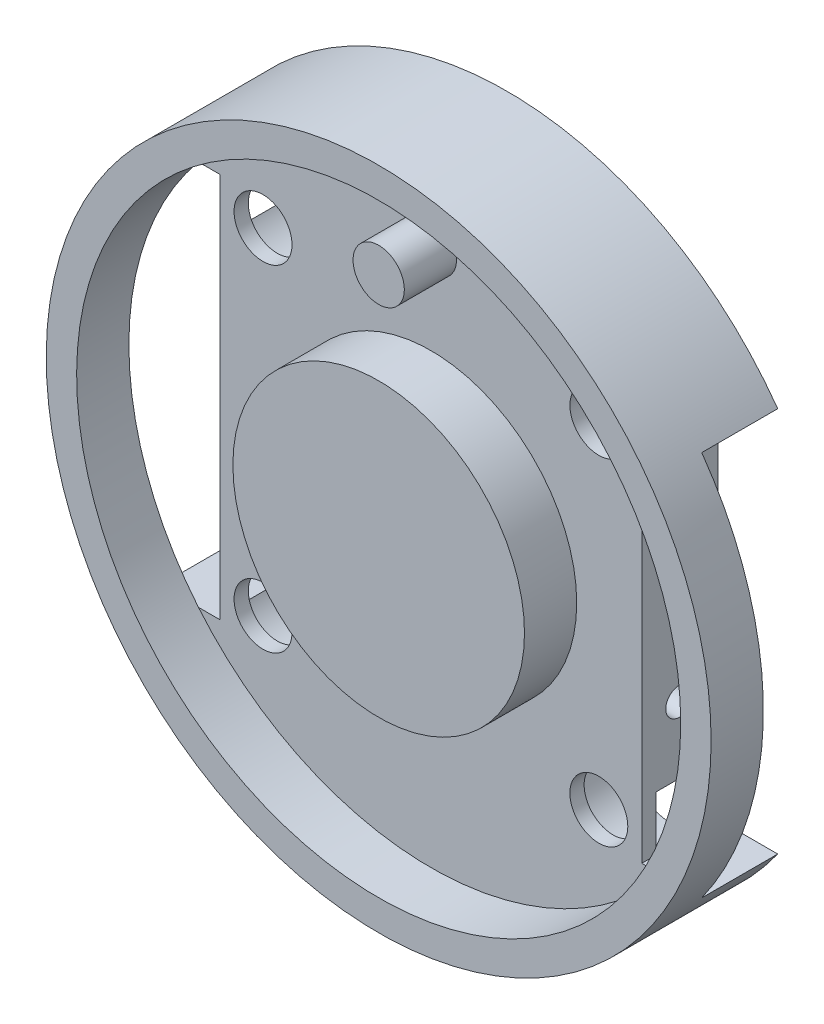
ISO-10303-21;
HEADER;
FILE_DESCRIPTION(('STEP AP214'),'2;1');
FILE_NAME('part.step','',(''),(''),'','','');
FILE_SCHEMA(('AUTOMOTIVE_DESIGN { 1 0 10303 214 1 1 1 1 }'));
ENDSEC;
DATA;
#1=APPLICATION_CONTEXT('core data for automotive mechanical design processes');
#2=APPLICATION_PROTOCOL_DEFINITION('international standard','automotive_design',2000,#1);
#3=PRODUCT_CONTEXT('',#1,'mechanical');
#4=PRODUCT('Part','Part','',(#3));
#5=PRODUCT_RELATED_PRODUCT_CATEGORY('part','',(#4));
#6=PRODUCT_DEFINITION_FORMATION('','',#4);
#7=PRODUCT_DEFINITION_CONTEXT('part definition',#1,'design');
#8=PRODUCT_DEFINITION('design','',#6,#7);
#9=PRODUCT_DEFINITION_SHAPE('','',#8);
#10=(LENGTH_UNIT() NAMED_UNIT(*) SI_UNIT(.MILLI.,.METRE.));
#11=(NAMED_UNIT(*) PLANE_ANGLE_UNIT() SI_UNIT($,.RADIAN.));
#12=(NAMED_UNIT(*) SI_UNIT($,.STERADIAN.) SOLID_ANGLE_UNIT());
#13=UNCERTAINTY_MEASURE_WITH_UNIT(LENGTH_MEASURE(1.E-05),#10,'distance_accuracy_value','');
#14=(GEOMETRIC_REPRESENTATION_CONTEXT(3) GLOBAL_UNCERTAINTY_ASSIGNED_CONTEXT((#13)) GLOBAL_UNIT_ASSIGNED_CONTEXT((#10,
#11,#12)) REPRESENTATION_CONTEXT('',''));
#15=CARTESIAN_POINT('',(0.,0.,0.));
#16=DIRECTION('',(0.,0.,1.));
#17=DIRECTION('',(1.,0.,0.));
#18=AXIS2_PLACEMENT_3D('',#15,#16,#17);
#19=CARTESIAN_POINT('',(17.6776695296638,-17.6776695296636,-0.000999999999999265));
#20=DIRECTION('',(0.,0.,1.));
#21=DIRECTION('',(1.,0.,0.));
#22=AXIS2_PLACEMENT_3D('',#19,#20,#21);
#23=CYLINDRICAL_SURFACE('',#22,3.05);
#24=CARTESIAN_POINT('',(17.6776695296638,-17.6776695296636,8.));
#25=DIRECTION('',(0.,0.,1.));
#26=DIRECTION('',(1.,0.,0.));
#27=AXIS2_PLACEMENT_3D('',#24,#25,#26);
#28=CIRCLE('',#27,3.05);
#29=CARTESIAN_POINT('',(20.7276695296638,-17.6776695296636,8.));
#30=VERTEX_POINT('',#29);
#31=EDGE_CURVE('E217',#30,#30,#28,.T.);
#32=ORIENTED_EDGE('',*,*,#31,.T.);
#33=EDGE_LOOP('',(#32));
#34=FACE_BOUND('',#33,.T.);
#35=CARTESIAN_POINT('',(17.6776695296638,-17.6776695296636,6.5));
#36=DIRECTION('',(0.,0.,-1.));
#37=DIRECTION('',(-1.,0.,0.));
#38=AXIS2_PLACEMENT_3D('',#35,#36,#37);
#39=CIRCLE('',#38,3.05);
#40=CARTESIAN_POINT('',(14.6276695296638,-17.6776695296636,6.5));
#41=VERTEX_POINT('',#40);
#42=EDGE_CURVE('E285',#41,#41,#39,.F.);
#43=ORIENTED_EDGE('',*,*,#42,.F.);
#44=EDGE_LOOP('',(#43));
#45=FACE_BOUND('',#44,.T.);
#46=ADVANCED_FACE('F47',(#34,#45),#23,.F.);
#47=CARTESIAN_POINT('',(17.6776695296636,17.6776695296638,-0.000999999999999265));
#48=DIRECTION('',(0.,0.,1.));
#49=DIRECTION('',(1.,0.,0.));
#50=AXIS2_PLACEMENT_3D('',#47,#48,#49);
#51=CYLINDRICAL_SURFACE('',#50,3.05);
#52=CARTESIAN_POINT('',(17.6776695296636,17.6776695296638,8.));
#53=DIRECTION('',(0.,0.,1.));
#54=DIRECTION('',(1.,0.,0.));
#55=AXIS2_PLACEMENT_3D('',#52,#53,#54);
#56=CIRCLE('',#55,3.05);
#57=CARTESIAN_POINT('',(20.7276695296636,17.6776695296638,8.));
#58=VERTEX_POINT('',#57);
#59=EDGE_CURVE('E365',#58,#58,#56,.T.);
#60=ORIENTED_EDGE('',*,*,#59,.T.);
#61=EDGE_LOOP('',(#60));
#62=FACE_BOUND('',#61,.T.);
#63=CARTESIAN_POINT('',(17.6776695296636,17.6776695296638,6.5));
#64=DIRECTION('',(0.,0.,-1.));
#65=DIRECTION('',(-1.,0.,0.));
#66=AXIS2_PLACEMENT_3D('',#63,#64,#65);
#67=CIRCLE('',#66,3.05);
#68=CARTESIAN_POINT('',(14.6276695296636,17.6776695296638,6.5));
#69=VERTEX_POINT('',#68);
#70=EDGE_CURVE('E280',#69,#69,#67,.F.);
#71=ORIENTED_EDGE('',*,*,#70,.F.);
#72=EDGE_LOOP('',(#71));
#73=FACE_BOUND('',#72,.T.);
#74=ADVANCED_FACE('F454',(#62,#73),#51,.F.);
#75=CARTESIAN_POINT('',(-17.6776695296638,17.6776695296636,-0.000999999999999265));
#76=DIRECTION('',(0.,0.,1.));
#77=DIRECTION('',(1.,0.,0.));
#78=AXIS2_PLACEMENT_3D('',#75,#76,#77);
#79=CYLINDRICAL_SURFACE('',#78,3.05);
#80=CARTESIAN_POINT('',(-17.6776695296638,17.6776695296636,8.));
#81=DIRECTION('',(0.,0.,1.));
#82=DIRECTION('',(1.,0.,0.));
#83=AXIS2_PLACEMENT_3D('',#80,#81,#82);
#84=CIRCLE('',#83,3.05);
#85=CARTESIAN_POINT('',(-14.6276695296638,17.6776695296636,8.));
#86=VERTEX_POINT('',#85);
#87=EDGE_CURVE('E368',#86,#86,#84,.T.);
#88=ORIENTED_EDGE('',*,*,#87,.T.);
#89=EDGE_LOOP('',(#88));
#90=FACE_BOUND('',#89,.T.);
#91=CARTESIAN_POINT('',(-17.6776695296638,17.6776695296636,6.5));
#92=DIRECTION('',(0.,0.,-1.));
#93=DIRECTION('',(-1.,0.,0.));
#94=AXIS2_PLACEMENT_3D('',#91,#92,#93);
#95=CIRCLE('',#94,3.05);
#96=CARTESIAN_POINT('',(-20.7276695296638,17.6776695296636,6.5));
#97=VERTEX_POINT('',#96);
#98=EDGE_CURVE('E275',#97,#97,#95,.F.);
#99=ORIENTED_EDGE('',*,*,#98,.F.);
#100=EDGE_LOOP('',(#99));
#101=FACE_BOUND('',#100,.T.);
#102=ADVANCED_FACE('F461',(#90,#101),#79,.F.);
#103=CARTESIAN_POINT('',(-17.6776695296636,-17.6776695296638,-0.000999999999999265));
#104=DIRECTION('',(0.,0.,1.));
#105=DIRECTION('',(1.,0.,0.));
#106=AXIS2_PLACEMENT_3D('',#103,#104,#105);
#107=CYLINDRICAL_SURFACE('',#106,3.05);
#108=CARTESIAN_POINT('',(-17.6776695296636,-17.6776695296638,8.));
#109=DIRECTION('',(0.,0.,1.));
#110=DIRECTION('',(1.,0.,0.));
#111=AXIS2_PLACEMENT_3D('',#108,#109,#110);
#112=CIRCLE('',#111,3.05);
#113=CARTESIAN_POINT('',(-14.6276695296636,-17.6776695296638,8.));
#114=VERTEX_POINT('',#113);
#115=EDGE_CURVE('E359',#114,#114,#112,.T.);
#116=ORIENTED_EDGE('',*,*,#115,.T.);
#117=EDGE_LOOP('',(#116));
#118=FACE_BOUND('',#117,.T.);
#119=CARTESIAN_POINT('',(-17.6776695296636,-17.6776695296638,6.5));
#120=DIRECTION('',(0.,0.,-1.));
#121=DIRECTION('',(-1.,0.,0.));
#122=AXIS2_PLACEMENT_3D('',#119,#120,#121);
#123=CIRCLE('',#122,3.05);
#124=CARTESIAN_POINT('',(-20.7276695296636,-17.6776695296638,6.5));
#125=VERTEX_POINT('',#124);
#126=EDGE_CURVE('E271',#125,#125,#123,.F.);
#127=ORIENTED_EDGE('',*,*,#126,.F.);
#128=EDGE_LOOP('',(#127));
#129=FACE_BOUND('',#128,.T.);
#130=ADVANCED_FACE('F373',(#118,#129),#107,.F.);
#131=CARTESIAN_POINT('',(0.,0.,8.));
#132=DIRECTION('',(0.,0.,1.));
#133=DIRECTION('',(1.,0.,0.));
#134=AXIS2_PLACEMENT_3D('',#131,#132,#133);
#135=PLANE('',#134);
#136=CARTESIAN_POINT('',(0.,0.,8.));
#137=DIRECTION('',(0.,0.,1.));
#138=DIRECTION('',(1.,0.,0.));
#139=AXIS2_PLACEMENT_3D('',#136,#137,#138);
#140=CIRCLE('',#139,15.3499999999999);
#141=CARTESIAN_POINT('',(-15.3499999999999,0.,8.));
#142=VERTEX_POINT('',#141);
#143=EDGE_CURVE('E340',#142,#142,#140,.T.);
#144=ORIENTED_EDGE('',*,*,#143,.F.);
#145=EDGE_LOOP('',(#144));
#146=FACE_BOUND('',#145,.T.);
#147=CARTESIAN_POINT('',(1.11022302462516E-13,24.9999999999999,8.));
#148=DIRECTION('',(0.,0.,1.));
#149=DIRECTION('',(1.,0.,0.));
#150=AXIS2_PLACEMENT_3D('',#147,#148,#149);
#151=CIRCLE('',#150,2.7);
#152=CARTESIAN_POINT('',(2.70000000000011,24.9999999999999,8.));
#153=VERTEX_POINT('',#152);
#154=EDGE_CURVE('E346',#153,#153,#151,.T.);
#155=ORIENTED_EDGE('',*,*,#154,.F.);
#156=EDGE_LOOP('',(#155));
#157=FACE_BOUND('',#156,.T.);
#158=ORIENTED_EDGE('',*,*,#115,.F.);
#159=EDGE_LOOP('',(#158));
#160=FACE_BOUND('',#159,.T.);
#161=ORIENTED_EDGE('',*,*,#87,.F.);
#162=EDGE_LOOP('',(#161));
#163=FACE_BOUND('',#162,.T.);
#164=ORIENTED_EDGE('',*,*,#59,.F.);
#165=EDGE_LOOP('',(#164));
#166=FACE_BOUND('',#165,.T.);
#167=ORIENTED_EDGE('',*,*,#31,.F.);
#168=EDGE_LOOP('',(#167));
#169=FACE_BOUND('',#168,.T.);
#170=DIRECTION('',(1.,0.,0.));
#171=VECTOR('',#170,1.);
#172=CARTESIAN_POINT('',(28.5115765961828,20.3,8.00000000000001));
#173=LINE('',#172,#171);
#174=CARTESIAN_POINT('',(22.2,20.3,8.00000000000001));
#175=VERTEX_POINT('',#174);
#176=CARTESIAN_POINT('',(24.4775407261432,20.3,8.));
#177=VERTEX_POINT('',#176);
#178=EDGE_CURVE('E248',#175,#177,#173,.T.);
#179=ORIENTED_EDGE('',*,*,#178,.T.);
#180=CARTESIAN_POINT('',(0.,0.,8.));
#181=DIRECTION('',(0.,0.,1.));
#182=DIRECTION('',(1.,0.,0.));
#183=AXIS2_PLACEMENT_3D('',#180,#181,#182);
#184=CIRCLE('',#183,31.8);
#185=CARTESIAN_POINT('',(-24.4775407261432,20.3,8.));
#186=VERTEX_POINT('',#185);
#187=EDGE_CURVE('E58',#177,#186,#184,.T.);
#188=ORIENTED_EDGE('',*,*,#187,.T.);
#189=DIRECTION('',(1.,0.,0.));
#190=VECTOR('',#189,1.);
#191=CARTESIAN_POINT('',(-22.2,20.3,8.00000000000001));
#192=LINE('',#191,#190);
#193=CARTESIAN_POINT('',(-22.2,20.3,8.00000000000001));
#194=VERTEX_POINT('',#193);
#195=EDGE_CURVE('E247',#186,#194,#192,.T.);
#196=ORIENTED_EDGE('',*,*,#195,.T.);
#197=DIRECTION('',(0.,-1.,0.));
#198=VECTOR('',#197,1.);
#199=CARTESIAN_POINT('',(-22.2,-20.3,8.00000000000001));
#200=LINE('',#199,#198);
#201=CARTESIAN_POINT('',(-22.2,-20.3,8.00000000000001));
#202=VERTEX_POINT('',#201);
#203=EDGE_CURVE('E56',#194,#202,#200,.T.);
#204=ORIENTED_EDGE('',*,*,#203,.T.);
#205=DIRECTION('',(-1.,0.,0.));
#206=VECTOR('',#205,1.);
#207=CARTESIAN_POINT('',(-22.2,-20.3,8.00000000000001));
#208=LINE('',#207,#206);
#209=CARTESIAN_POINT('',(-24.4775407261432,-20.3,8.));
#210=VERTEX_POINT('',#209);
#211=EDGE_CURVE('E211',#202,#210,#208,.T.);
#212=ORIENTED_EDGE('',*,*,#211,.T.);
#213=CARTESIAN_POINT('',(24.4775407261432,-20.3,8.));
#214=VERTEX_POINT('',#213);
#215=EDGE_CURVE('E12',#210,#214,#184,.T.);
#216=ORIENTED_EDGE('',*,*,#215,.T.);
#217=DIRECTION('',(-1.,0.,0.));
#218=VECTOR('',#217,1.);
#219=CARTESIAN_POINT('',(28.5115765961828,-20.3,8.00000000000001));
#220=LINE('',#219,#218);
#221=CARTESIAN_POINT('',(22.2,-20.3,8.00000000000001));
#222=VERTEX_POINT('',#221);
#223=EDGE_CURVE('E257',#214,#222,#220,.T.);
#224=ORIENTED_EDGE('',*,*,#223,.T.);
#225=DIRECTION('',(0.,1.,0.));
#226=VECTOR('',#225,1.);
#227=CARTESIAN_POINT('',(22.2,-20.3,8.00000000000001));
#228=LINE('',#227,#226);
#229=EDGE_CURVE('E252',#222,#175,#228,.T.);
#230=ORIENTED_EDGE('',*,*,#229,.T.);
#231=EDGE_LOOP('',(#179,#188,#196,#204,#212,#216,#224,#230));
#232=FACE_BOUND('',#231,.T.);
#233=ADVANCED_FACE('F49',(#146,#157,#160,#163,#166,#169,#232),#135,.T.);
#234=CARTESIAN_POINT('',(0.,0.,98.2864330893629));
#235=DIRECTION('',(0.,0.,-1.));
#236=DIRECTION('',(-1.,0.,0.));
#237=AXIS2_PLACEMENT_3D('',#234,#235,#236);
#238=CYLINDRICAL_SURFACE('',#237,35.);
#239=DIRECTION('',(0.,0.,-1.));
#240=VECTOR('',#239,1.);
#241=CARTESIAN_POINT('',(28.5115765961828,-20.3,98.2864330893629));
#242=LINE('',#241,#240);
#243=CARTESIAN_POINT('',(28.5115765961828,-20.3,8.));
#244=VERTEX_POINT('',#243);
#245=CARTESIAN_POINT('',(28.5115765961828,-20.3,0.));
#246=VERTEX_POINT('',#245);
#247=EDGE_CURVE('E239',#244,#246,#242,.T.);
#248=ORIENTED_EDGE('',*,*,#247,.F.);
#249=CARTESIAN_POINT('',(0.,0.,8.));
#250=DIRECTION('',(0.,0.,1.));
#251=DIRECTION('',(1.,0.,0.));
#252=AXIS2_PLACEMENT_3D('',#249,#250,#251);
#253=CIRCLE('',#252,35.);
#254=CARTESIAN_POINT('',(28.5115765961828,20.3,8.));
#255=VERTEX_POINT('',#254);
#256=EDGE_CURVE('E350',#244,#255,#253,.T.);
#257=ORIENTED_EDGE('',*,*,#256,.T.);
#258=DIRECTION('',(0.,0.,-1.));
#259=VECTOR('',#258,1.);
#260=CARTESIAN_POINT('',(28.5115765961828,20.3,98.2864330893629));
#261=LINE('',#260,#259);
#262=CARTESIAN_POINT('',(28.5115765961828,20.3,0.));
#263=VERTEX_POINT('',#262);
#264=EDGE_CURVE('E228',#255,#263,#261,.T.);
#265=ORIENTED_EDGE('',*,*,#264,.T.);
#266=CARTESIAN_POINT('',(0.,0.,0.));
#267=DIRECTION('',(0.,0.,1.));
#268=DIRECTION('',(1.,0.,0.));
#269=AXIS2_PLACEMENT_3D('',#266,#267,#268);
#270=CIRCLE('',#269,35.);
#271=CARTESIAN_POINT('',(-28.5115765961829,20.3,0.));
#272=VERTEX_POINT('',#271);
#273=EDGE_CURVE('E225',#263,#272,#270,.T.);
#274=ORIENTED_EDGE('',*,*,#273,.T.);
#275=DIRECTION('',(0.,0.,-1.));
#276=VECTOR('',#275,1.);
#277=CARTESIAN_POINT('',(-28.5115765961829,20.3,98.2864330893629));
#278=LINE('',#277,#276);
#279=CARTESIAN_POINT('',(-28.5115765961829,20.3,8.));
#280=VERTEX_POINT('',#279);
#281=EDGE_CURVE('E224',#280,#272,#278,.T.);
#282=ORIENTED_EDGE('',*,*,#281,.F.);
#283=CARTESIAN_POINT('',(-28.5115765961828,-20.3,8.));
#284=VERTEX_POINT('',#283);
#285=EDGE_CURVE('E361',#280,#284,#253,.T.);
#286=ORIENTED_EDGE('',*,*,#285,.T.);
#287=DIRECTION('',(0.,0.,-1.));
#288=VECTOR('',#287,1.);
#289=CARTESIAN_POINT('',(-28.5115765961828,-20.3,98.2864330893629));
#290=LINE('',#289,#288);
#291=CARTESIAN_POINT('',(-28.5115765961828,-20.3,0.));
#292=VERTEX_POINT('',#291);
#293=EDGE_CURVE('E241',#284,#292,#290,.T.);
#294=ORIENTED_EDGE('',*,*,#293,.T.);
#295=CARTESIAN_POINT('',(0.,0.,0.));
#296=DIRECTION('',(0.,0.,1.));
#297=DIRECTION('',(1.,0.,0.));
#298=AXIS2_PLACEMENT_3D('',#295,#296,#297);
#299=CIRCLE('',#298,35.);
#300=EDGE_CURVE('E207',#292,#246,#299,.T.);
#301=ORIENTED_EDGE('',*,*,#300,.T.);
#302=EDGE_LOOP('',(#248,#257,#265,#274,#282,#286,#294,#301));
#303=FACE_BOUND('',#302,.T.);
#304=CARTESIAN_POINT('',(0.,0.,13.5));
#305=DIRECTION('',(0.,0.,1.));
#306=DIRECTION('',(1.,0.,0.));
#307=AXIS2_PLACEMENT_3D('',#304,#305,#306);
#308=CIRCLE('',#307,35.);
#309=CARTESIAN_POINT('',(35.,0.,13.5));
#310=VERTEX_POINT('',#309);
#311=EDGE_CURVE('E353',#310,#310,#308,.T.);
#312=ORIENTED_EDGE('',*,*,#311,.F.);
#313=EDGE_LOOP('',(#312));
#314=FACE_BOUND('',#313,.T.);
#315=ADVANCED_FACE('F378',(#303,#314),#238,.T.);
#316=CARTESIAN_POINT('',(28.5115765961828,-20.3,98.2864330893629));
#317=DIRECTION('',(0.,-1.,0.));
#318=DIRECTION('',(1.,0.,0.));
#319=AXIS2_PLACEMENT_3D('',#316,#317,#318);
#320=PLANE('',#319);
#321=DIRECTION('',(-1.,0.,0.));
#322=VECTOR('',#321,1.);
#323=CARTESIAN_POINT('',(28.5115765961828,-20.3,0.));
#324=LINE('',#323,#322);
#325=CARTESIAN_POINT('',(22.5122721921735,-20.3,0.));
#326=VERTEX_POINT('',#325);
#327=EDGE_CURVE('E236',#246,#326,#324,.T.);
#328=ORIENTED_EDGE('',*,*,#327,.T.);
#329=DIRECTION('',(0.,0.,-1.));
#330=VECTOR('',#329,1.);
#331=CARTESIAN_POINT('',(22.5122721921735,-20.3,6.5));
#332=LINE('',#331,#330);
#333=CARTESIAN_POINT('',(22.5122721921735,-20.3,6.5));
#334=VERTEX_POINT('',#333);
#335=EDGE_CURVE('E66',#326,#334,#332,.F.);
#336=ORIENTED_EDGE('',*,*,#335,.T.);
#337=DIRECTION('',(1.,0.,0.));
#338=VECTOR('',#337,1.);
#339=CARTESIAN_POINT('',(28.5115765961828,-20.3,6.50000000000001));
#340=LINE('',#339,#338);
#341=CARTESIAN_POINT('',(22.2,-20.3,6.50000000000001));
#342=VERTEX_POINT('',#341);
#343=EDGE_CURVE('E324',#342,#334,#340,.T.);
#344=ORIENTED_EDGE('',*,*,#343,.F.);
#345=DIRECTION('',(0.,0.,-1.));
#346=VECTOR('',#345,1.);
#347=CARTESIAN_POINT('',(22.2,-20.3,98.2864330893629));
#348=LINE('',#347,#346);
#349=EDGE_CURVE('E235',#222,#342,#348,.T.);
#350=ORIENTED_EDGE('',*,*,#349,.F.);
#351=ORIENTED_EDGE('',*,*,#223,.F.);
#352=EDGE_CURVE('E255',#244,#214,#220,.T.);
#353=ORIENTED_EDGE('',*,*,#352,.F.);
#354=ORIENTED_EDGE('',*,*,#247,.T.);
#355=EDGE_LOOP('',(#328,#336,#344,#350,#351,#353,#354));
#356=FACE_BOUND('',#355,.T.);
#357=ADVANCED_FACE('F418',(#356),#320,.F.);
#358=CARTESIAN_POINT('',(22.2,-20.3,98.2864330893629));
#359=DIRECTION('',(-1.,0.,0.));
#360=DIRECTION('',(0.,-1.,0.));
#361=AXIS2_PLACEMENT_3D('',#358,#359,#360);
#362=PLANE('',#361);
#363=CARTESIAN_POINT('',(22.2,7.5,4.));
#364=DIRECTION('',(-1.,0.,0.));
#365=DIRECTION('',(0.,-1.,0.));
#366=AXIS2_PLACEMENT_3D('',#363,#364,#365);
#367=CIRCLE('',#366,1.475);
#368=CARTESIAN_POINT('',(22.2,6.025,4.));
#369=VERTEX_POINT('',#368);
#370=EDGE_CURVE('E299',#369,#369,#367,.T.);
#371=ORIENTED_EDGE('',*,*,#370,.T.);
#372=EDGE_LOOP('',(#371));
#373=FACE_BOUND('',#372,.T.);
#374=CARTESIAN_POINT('',(22.2,-7.5,4.));
#375=DIRECTION('',(-1.,0.,0.));
#376=DIRECTION('',(0.,-1.,0.));
#377=AXIS2_PLACEMENT_3D('',#374,#375,#376);
#378=CIRCLE('',#377,1.475);
#379=CARTESIAN_POINT('',(22.2,-8.975,4.));
#380=VERTEX_POINT('',#379);
#381=EDGE_CURVE('E291',#380,#380,#378,.T.);
#382=ORIENTED_EDGE('',*,*,#381,.T.);
#383=EDGE_LOOP('',(#382));
#384=FACE_BOUND('',#383,.T.);
#385=DIRECTION('',(0.,-1.,0.));
#386=VECTOR('',#385,1.);
#387=CARTESIAN_POINT('',(22.2,-20.3,6.50000000000001));
#388=LINE('',#387,#386);
#389=CARTESIAN_POINT('',(22.2,-14.5474096176006,6.5));
#390=VERTEX_POINT('',#389);
#391=EDGE_CURVE('E287',#390,#342,#388,.T.);
#392=ORIENTED_EDGE('',*,*,#391,.F.);
#393=DIRECTION('',(0.,0.,-1.));
#394=VECTOR('',#393,1.);
#395=CARTESIAN_POINT('',(22.2,-14.5474096176006,6.5));
#396=LINE('',#395,#394);
#397=CARTESIAN_POINT('',(22.2,-14.5474096176006,0.));
#398=VERTEX_POINT('',#397);
#399=EDGE_CURVE('E336',#390,#398,#396,.T.);
#400=ORIENTED_EDGE('',*,*,#399,.T.);
#401=DIRECTION('',(0.,1.,0.));
#402=VECTOR('',#401,1.);
#403=CARTESIAN_POINT('',(22.2,-20.3,0.));
#404=LINE('',#403,#402);
#405=CARTESIAN_POINT('',(22.2,14.5474096176005,0.));
#406=VERTEX_POINT('',#405);
#407=EDGE_CURVE('E232',#398,#406,#404,.T.);
#408=ORIENTED_EDGE('',*,*,#407,.T.);
#409=DIRECTION('',(0.,0.,-1.));
#410=VECTOR('',#409,1.);
#411=CARTESIAN_POINT('',(22.2,14.5474096176005,6.5));
#412=LINE('',#411,#410);
#413=CARTESIAN_POINT('',(22.2,14.5474096176005,6.5));
#414=VERTEX_POINT('',#413);
#415=EDGE_CURVE('E74',#406,#414,#412,.F.);
#416=ORIENTED_EDGE('',*,*,#415,.T.);
#417=DIRECTION('',(0.,-1.,0.));
#418=VECTOR('',#417,1.);
#419=CARTESIAN_POINT('',(22.2,-20.3,6.50000000000001));
#420=LINE('',#419,#418);
#421=CARTESIAN_POINT('',(22.2,20.3,6.50000000000001));
#422=VERTEX_POINT('',#421);
#423=EDGE_CURVE('E288',#422,#414,#420,.T.);
#424=ORIENTED_EDGE('',*,*,#423,.F.);
#425=DIRECTION('',(0.,0.,-1.));
#426=VECTOR('',#425,1.);
#427=CARTESIAN_POINT('',(22.2,20.3,98.2864330893629));
#428=LINE('',#427,#426);
#429=EDGE_CURVE('E231',#175,#422,#428,.T.);
#430=ORIENTED_EDGE('',*,*,#429,.F.);
#431=ORIENTED_EDGE('',*,*,#229,.F.);
#432=ORIENTED_EDGE('',*,*,#349,.T.);
#433=EDGE_LOOP('',(#392,#400,#408,#416,#424,#430,#431,#432));
#434=FACE_BOUND('',#433,.T.);
#435=ADVANCED_FACE('F399',(#373,#384,#434),#362,.F.);
#436=CARTESIAN_POINT('',(28.5115765961828,20.3,98.2864330893629));
#437=DIRECTION('',(0.,1.,0.));
#438=DIRECTION('',(-1.,0.,0.));
#439=AXIS2_PLACEMENT_3D('',#436,#437,#438);
#440=PLANE('',#439);
#441=DIRECTION('',(-1.,0.,0.));
#442=VECTOR('',#441,1.);
#443=CARTESIAN_POINT('',(28.5115765961828,20.3,6.50000000000001));
#444=LINE('',#443,#442);
#445=CARTESIAN_POINT('',(22.5122721921735,20.3,6.5));
#446=VERTEX_POINT('',#445);
#447=EDGE_CURVE('E283',#446,#422,#444,.T.);
#448=ORIENTED_EDGE('',*,*,#447,.F.);
#449=DIRECTION('',(0.,0.,-1.));
#450=VECTOR('',#449,1.);
#451=CARTESIAN_POINT('',(22.5122721921735,20.3,6.5));
#452=LINE('',#451,#450);
#453=CARTESIAN_POINT('',(22.5122721921735,20.3,0.));
#454=VERTEX_POINT('',#453);
#455=EDGE_CURVE('E326',#446,#454,#452,.T.);
#456=ORIENTED_EDGE('',*,*,#455,.T.);
#457=DIRECTION('',(1.,0.,0.));
#458=VECTOR('',#457,1.);
#459=CARTESIAN_POINT('',(28.5115765961828,20.3,0.));
#460=LINE('',#459,#458);
#461=EDGE_CURVE('E229',#454,#263,#460,.T.);
#462=ORIENTED_EDGE('',*,*,#461,.T.);
#463=ORIENTED_EDGE('',*,*,#264,.F.);
#464=EDGE_CURVE('E251',#177,#255,#173,.T.);
#465=ORIENTED_EDGE('',*,*,#464,.F.);
#466=ORIENTED_EDGE('',*,*,#178,.F.);
#467=ORIENTED_EDGE('',*,*,#429,.T.);
#468=EDGE_LOOP('',(#448,#456,#462,#463,#465,#466,#467));
#469=FACE_BOUND('',#468,.T.);
#470=ADVANCED_FACE('F394',(#469),#440,.F.);
#471=CARTESIAN_POINT('',(-22.2,20.3,98.2864330893629));
#472=DIRECTION('',(0.,1.,0.));
#473=DIRECTION('',(-1.,0.,0.));
#474=AXIS2_PLACEMENT_3D('',#471,#472,#473);
#475=PLANE('',#474);
#476=DIRECTION('',(1.,0.,0.));
#477=VECTOR('',#476,1.);
#478=CARTESIAN_POINT('',(-22.2,20.3,0.));
#479=LINE('',#478,#477);
#480=CARTESIAN_POINT('',(-22.5122721921733,20.3,0.));
#481=VERTEX_POINT('',#480);
#482=EDGE_CURVE('E221',#272,#481,#479,.T.);
#483=ORIENTED_EDGE('',*,*,#482,.T.);
#484=DIRECTION('',(0.,0.,-1.));
#485=VECTOR('',#484,1.);
#486=CARTESIAN_POINT('',(-22.5122721921733,20.3,6.5));
#487=LINE('',#486,#485);
#488=CARTESIAN_POINT('',(-22.5122721921733,20.3,6.5));
#489=VERTEX_POINT('',#488);
#490=EDGE_CURVE('E200',#481,#489,#487,.F.);
#491=ORIENTED_EDGE('',*,*,#490,.T.);
#492=DIRECTION('',(-1.,0.,0.));
#493=VECTOR('',#492,1.);
#494=CARTESIAN_POINT('',(-22.2,20.3,6.50000000000001));
#495=LINE('',#494,#493);
#496=CARTESIAN_POINT('',(-22.2,20.3,6.50000000000001));
#497=VERTEX_POINT('',#496);
#498=EDGE_CURVE('E284',#497,#489,#495,.T.);
#499=ORIENTED_EDGE('',*,*,#498,.F.);
#500=DIRECTION('',(0.,0.,-1.));
#501=VECTOR('',#500,1.);
#502=CARTESIAN_POINT('',(-22.2,20.3,98.2864330893629));
#503=LINE('',#502,#501);
#504=EDGE_CURVE('E220',#194,#497,#503,.T.);
#505=ORIENTED_EDGE('',*,*,#504,.F.);
#506=ORIENTED_EDGE('',*,*,#195,.F.);
#507=EDGE_CURVE('E244',#280,#186,#192,.T.);
#508=ORIENTED_EDGE('',*,*,#507,.F.);
#509=ORIENTED_EDGE('',*,*,#281,.T.);
#510=EDGE_LOOP('',(#483,#491,#499,#505,#506,#508,#509));
#511=FACE_BOUND('',#510,.T.);
#512=ADVANCED_FACE('F429',(#511),#475,.F.);
#513=CARTESIAN_POINT('',(-22.2,-20.3,98.2864330893629));
#514=DIRECTION('',(1.,0.,0.));
#515=DIRECTION('',(0.,1.,0.));
#516=AXIS2_PLACEMENT_3D('',#513,#514,#515);
#517=PLANE('',#516);
#518=CARTESIAN_POINT('',(-22.2,7.5,4.));
#519=DIRECTION('',(1.,0.,0.));
#520=DIRECTION('',(0.,1.,0.));
#521=AXIS2_PLACEMENT_3D('',#518,#519,#520);
#522=CIRCLE('',#521,1.475);
#523=CARTESIAN_POINT('',(-22.2,8.975,4.));
#524=VERTEX_POINT('',#523);
#525=EDGE_CURVE('E51',#524,#524,#522,.T.);
#526=ORIENTED_EDGE('',*,*,#525,.T.);
#527=EDGE_LOOP('',(#526));
#528=FACE_BOUND('',#527,.T.);
#529=CARTESIAN_POINT('',(-22.2,-7.5,4.));
#530=DIRECTION('',(1.,0.,0.));
#531=DIRECTION('',(0.,1.,0.));
#532=AXIS2_PLACEMENT_3D('',#529,#530,#531);
#533=CIRCLE('',#532,1.475);
#534=CARTESIAN_POINT('',(-22.2,-6.025,4.));
#535=VERTEX_POINT('',#534);
#536=EDGE_CURVE('E289',#535,#535,#533,.T.);
#537=ORIENTED_EDGE('',*,*,#536,.T.);
#538=EDGE_LOOP('',(#537));
#539=FACE_BOUND('',#538,.T.);
#540=DIRECTION('',(0.,-1.,0.));
#541=VECTOR('',#540,1.);
#542=CARTESIAN_POINT('',(-22.2,-20.3,0.));
#543=LINE('',#542,#541);
#544=CARTESIAN_POINT('',(-22.2,14.5474096176009,0.));
#545=VERTEX_POINT('',#544);
#546=CARTESIAN_POINT('',(-22.2,-14.5474096176007,0.));
#547=VERTEX_POINT('',#546);
#548=EDGE_CURVE('E213',#545,#547,#543,.T.);
#549=ORIENTED_EDGE('',*,*,#548,.T.);
#550=DIRECTION('',(0.,0.,-1.));
#551=VECTOR('',#550,1.);
#552=CARTESIAN_POINT('',(-22.2,-14.5474096176007,6.5));
#553=LINE('',#552,#551);
#554=CARTESIAN_POINT('',(-22.2,-14.5474096176007,6.5));
#555=VERTEX_POINT('',#554);
#556=EDGE_CURVE('E184',#547,#555,#553,.F.);
#557=ORIENTED_EDGE('',*,*,#556,.T.);
#558=DIRECTION('',(0.,1.,0.));
#559=VECTOR('',#558,1.);
#560=CARTESIAN_POINT('',(-22.2,-20.3,6.50000000000001));
#561=LINE('',#560,#559);
#562=CARTESIAN_POINT('',(-22.2,-20.3,6.50000000000001));
#563=VERTEX_POINT('',#562);
#564=EDGE_CURVE('E279',#563,#555,#561,.T.);
#565=ORIENTED_EDGE('',*,*,#564,.F.);
#566=DIRECTION('',(0.,0.,-1.));
#567=VECTOR('',#566,1.);
#568=CARTESIAN_POINT('',(-22.2,-20.3,98.2864330893629));
#569=LINE('',#568,#567);
#570=EDGE_CURVE('E209',#202,#563,#569,.T.);
#571=ORIENTED_EDGE('',*,*,#570,.F.);
#572=ORIENTED_EDGE('',*,*,#203,.F.);
#573=ORIENTED_EDGE('',*,*,#504,.T.);
#574=DIRECTION('',(0.,1.,0.));
#575=VECTOR('',#574,1.);
#576=CARTESIAN_POINT('',(-22.2,-20.3,6.50000000000001));
#577=LINE('',#576,#575);
#578=CARTESIAN_POINT('',(-22.2,14.5474096176009,6.5));
#579=VERTEX_POINT('',#578);
#580=EDGE_CURVE('E278',#579,#497,#577,.T.);
#581=ORIENTED_EDGE('',*,*,#580,.F.);
#582=DIRECTION('',(0.,0.,-1.));
#583=VECTOR('',#582,1.);
#584=CARTESIAN_POINT('',(-22.2,14.5474096176009,6.5));
#585=LINE('',#584,#583);
#586=EDGE_CURVE('E330',#579,#545,#585,.T.);
#587=ORIENTED_EDGE('',*,*,#586,.T.);
#588=EDGE_LOOP('',(#549,#557,#565,#571,#572,#573,#581,#587));
#589=FACE_BOUND('',#588,.T.);
#590=ADVANCED_FACE('F434',(#528,#539,#589),#517,.F.);
#591=CARTESIAN_POINT('',(-22.2,-20.3,98.2864330893629));
#592=DIRECTION('',(0.,-1.,0.));
#593=DIRECTION('',(1.,0.,0.));
#594=AXIS2_PLACEMENT_3D('',#591,#592,#593);
#595=PLANE('',#594);
#596=DIRECTION('',(1.,0.,0.));
#597=VECTOR('',#596,1.);
#598=CARTESIAN_POINT('',(-22.2,-20.3,6.50000000000001));
#599=LINE('',#598,#597);
#600=CARTESIAN_POINT('',(-22.5122721921734,-20.3,6.5));
#601=VERTEX_POINT('',#600);
#602=EDGE_CURVE('E199',#601,#563,#599,.T.);
#603=ORIENTED_EDGE('',*,*,#602,.F.);
#604=DIRECTION('',(0.,0.,-1.));
#605=VECTOR('',#604,1.);
#606=CARTESIAN_POINT('',(-22.5122721921734,-20.3,6.5));
#607=LINE('',#606,#605);
#608=CARTESIAN_POINT('',(-22.5122721921734,-20.3,0.));
#609=VERTEX_POINT('',#608);
#610=EDGE_CURVE('E181',#601,#609,#607,.T.);
#611=ORIENTED_EDGE('',*,*,#610,.T.);
#612=DIRECTION('',(-1.,0.,0.));
#613=VECTOR('',#612,1.);
#614=CARTESIAN_POINT('',(-22.2,-20.3,0.));
#615=LINE('',#614,#613);
#616=EDGE_CURVE('E196',#609,#292,#615,.T.);
#617=ORIENTED_EDGE('',*,*,#616,.T.);
#618=ORIENTED_EDGE('',*,*,#293,.F.);
#619=EDGE_CURVE('E208',#210,#284,#208,.T.);
#620=ORIENTED_EDGE('',*,*,#619,.F.);
#621=ORIENTED_EDGE('',*,*,#211,.F.);
#622=ORIENTED_EDGE('',*,*,#570,.T.);
#623=EDGE_LOOP('',(#603,#611,#617,#618,#620,#621,#622));
#624=FACE_BOUND('',#623,.T.);
#625=ADVANCED_FACE('F194',(#624),#595,.F.);
#626=CARTESIAN_POINT('',(0.,0.,0.));
#627=DIRECTION('',(0.,0.,1.));
#628=DIRECTION('',(1.,0.,0.));
#629=AXIS2_PLACEMENT_3D('',#626,#627,#628);
#630=PLANE('',#629);
#631=ORIENTED_EDGE('',*,*,#407,.F.);
#632=CARTESIAN_POINT('',(17.6776695296638,-17.6776695296637,0.));
#633=DIRECTION('',(0.,0.,-1.));
#634=DIRECTION('',(-1.,0.,0.));
#635=AXIS2_PLACEMENT_3D('',#632,#633,#634);
#636=CIRCLE('',#635,5.5);
#637=EDGE_CURVE('E310',#326,#398,#636,.T.);
#638=ORIENTED_EDGE('',*,*,#637,.F.);
#639=ORIENTED_EDGE('',*,*,#327,.F.);
#640=ORIENTED_EDGE('',*,*,#300,.F.);
#641=ORIENTED_EDGE('',*,*,#616,.F.);
#642=CARTESIAN_POINT('',(-17.6776695296638,-17.6776695296637,0.));
#643=DIRECTION('',(0.,0.,-1.));
#644=DIRECTION('',(-1.,0.,0.));
#645=AXIS2_PLACEMENT_3D('',#642,#643,#644);
#646=CIRCLE('',#645,5.5);
#647=EDGE_CURVE('E177',#547,#609,#646,.T.);
#648=ORIENTED_EDGE('',*,*,#647,.F.);
#649=ORIENTED_EDGE('',*,*,#548,.F.);
#650=CARTESIAN_POINT('',(-17.6776695296636,17.6776695296637,0.));
#651=DIRECTION('',(0.,0.,-1.));
#652=DIRECTION('',(-1.,0.,0.));
#653=AXIS2_PLACEMENT_3D('',#650,#651,#652);
#654=CIRCLE('',#653,5.5);
#655=EDGE_CURVE('E304',#481,#545,#654,.T.);
#656=ORIENTED_EDGE('',*,*,#655,.F.);
#657=ORIENTED_EDGE('',*,*,#482,.F.);
#658=ORIENTED_EDGE('',*,*,#273,.F.);
#659=ORIENTED_EDGE('',*,*,#461,.F.);
#660=CARTESIAN_POINT('',(17.6776695296639,17.6776695296637,0.));
#661=DIRECTION('',(0.,0.,-1.));
#662=DIRECTION('',(-1.,0.,0.));
#663=AXIS2_PLACEMENT_3D('',#660,#661,#662);
#664=CIRCLE('',#663,5.5);
#665=EDGE_CURVE('E306',#406,#454,#664,.T.);
#666=ORIENTED_EDGE('',*,*,#665,.F.);
#667=EDGE_LOOP('',(#631,#638,#639,#640,#641,#648,#649,#656,#657,#658,#659,#666));
#668=FACE_BOUND('',#667,.T.);
#669=ADVANCED_FACE('F204',(#668),#630,.F.);
#670=CARTESIAN_POINT('',(0.,0.,8.));
#671=DIRECTION('',(0.,0.,1.));
#672=DIRECTION('',(1.,0.,0.));
#673=AXIS2_PLACEMENT_3D('',#670,#671,#672);
#674=PLANE('',#673);
#675=EDGE_CURVE('E59',#186,#210,#184,.T.);
#676=ORIENTED_EDGE('',*,*,#675,.T.);
#677=ORIENTED_EDGE('',*,*,#619,.T.);
#678=ORIENTED_EDGE('',*,*,#285,.F.);
#679=ORIENTED_EDGE('',*,*,#507,.T.);
#680=EDGE_LOOP('',(#676,#677,#678,#679));
#681=FACE_BOUND('',#680,.T.);
#682=ADVANCED_FACE('F426',(#681),#674,.F.);
#683=ORIENTED_EDGE('',*,*,#256,.F.);
#684=ORIENTED_EDGE('',*,*,#352,.T.);
#685=EDGE_CURVE('E364',#214,#177,#184,.T.);
#686=ORIENTED_EDGE('',*,*,#685,.T.);
#687=ORIENTED_EDGE('',*,*,#464,.T.);
#688=EDGE_LOOP('',(#683,#684,#686,#687));
#689=FACE_BOUND('',#688,.T.);
#690=ADVANCED_FACE('F415',(#689),#674,.F.);
#691=CARTESIAN_POINT('',(0.,0.,13.5));
#692=DIRECTION('',(0.,0.,-1.));
#693=DIRECTION('',(-1.,0.,0.));
#694=AXIS2_PLACEMENT_3D('',#691,#692,#693);
#695=CYLINDRICAL_SURFACE('',#694,31.8);
#696=CARTESIAN_POINT('',(0.,0.,13.5));
#697=DIRECTION('',(0.,0.,1.));
#698=DIRECTION('',(1.,0.,0.));
#699=AXIS2_PLACEMENT_3D('',#696,#697,#698);
#700=CIRCLE('',#699,31.8);
#701=CARTESIAN_POINT('',(31.8,0.,13.5));
#702=VERTEX_POINT('',#701);
#703=EDGE_CURVE('E356',#702,#702,#700,.T.);
#704=ORIENTED_EDGE('',*,*,#703,.T.);
#705=EDGE_LOOP('',(#704));
#706=FACE_BOUND('',#705,.T.);
#707=ORIENTED_EDGE('',*,*,#187,.F.);
#708=ORIENTED_EDGE('',*,*,#685,.F.);
#709=ORIENTED_EDGE('',*,*,#215,.F.);
#710=ORIENTED_EDGE('',*,*,#675,.F.);
#711=EDGE_LOOP('',(#707,#708,#709,#710));
#712=FACE_BOUND('',#711,.T.);
#713=ADVANCED_FACE('F423',(#706,#712),#695,.F.);
#714=CARTESIAN_POINT('',(0.,0.,13.5));
#715=DIRECTION('',(0.,0.,1.));
#716=DIRECTION('',(1.,0.,0.));
#717=AXIS2_PLACEMENT_3D('',#714,#715,#716);
#718=PLANE('',#717);
#719=ORIENTED_EDGE('',*,*,#311,.T.);
#720=EDGE_LOOP('',(#719));
#721=FACE_BOUND('',#720,.T.);
#722=ORIENTED_EDGE('',*,*,#703,.F.);
#723=EDGE_LOOP('',(#722));
#724=FACE_BOUND('',#723,.T.);
#725=ADVANCED_FACE('F508',(#721,#724),#718,.T.);
#726=CARTESIAN_POINT('',(1.11022302462516E-13,24.9999999999999,13.5));
#727=DIRECTION('',(0.,0.,-1.));
#728=DIRECTION('',(-1.,0.,0.));
#729=AXIS2_PLACEMENT_3D('',#726,#727,#728);
#730=CYLINDRICAL_SURFACE('',#729,2.7);
#731=CARTESIAN_POINT('',(1.11022302462516E-13,24.9999999999999,13.5));
#732=DIRECTION('',(0.,0.,1.));
#733=DIRECTION('',(1.,0.,0.));
#734=AXIS2_PLACEMENT_3D('',#731,#732,#733);
#735=CIRCLE('',#734,2.7);
#736=CARTESIAN_POINT('',(2.70000000000011,24.9999999999999,13.5));
#737=VERTEX_POINT('',#736);
#738=EDGE_CURVE('E347',#737,#737,#735,.T.);
#739=ORIENTED_EDGE('',*,*,#738,.F.);
#740=EDGE_LOOP('',(#739));
#741=FACE_BOUND('',#740,.T.);
#742=ORIENTED_EDGE('',*,*,#154,.T.);
#743=EDGE_LOOP('',(#742));
#744=FACE_BOUND('',#743,.T.);
#745=ADVANCED_FACE('F518',(#741,#744),#730,.T.);
#746=CARTESIAN_POINT('',(0.,0.,13.5));
#747=DIRECTION('',(0.,0.,1.));
#748=DIRECTION('',(1.,0.,0.));
#749=AXIS2_PLACEMENT_3D('',#746,#747,#748);
#750=PLANE('',#749);
#751=ORIENTED_EDGE('',*,*,#738,.T.);
#752=EDGE_LOOP('',(#751));
#753=FACE_BOUND('',#752,.T.);
#754=ADVANCED_FACE('F527',(#753),#750,.T.);
#755=CARTESIAN_POINT('',(0.,0.,56.9163563648538));
#756=DIRECTION('',(0.,0.,-1.));
#757=DIRECTION('',(-1.,0.,0.));
#758=AXIS2_PLACEMENT_3D('',#755,#756,#757);
#759=CYLINDRICAL_SURFACE('',#758,15.3499999999999);
#760=CARTESIAN_POINT('',(0.,0.,13.5));
#761=DIRECTION('',(0.,0.,1.));
#762=DIRECTION('',(1.,0.,0.));
#763=AXIS2_PLACEMENT_3D('',#760,#761,#762);
#764=CIRCLE('',#763,15.3499999999999);
#765=CARTESIAN_POINT('',(-15.3499999999999,0.,13.5));
#766=VERTEX_POINT('',#765);
#767=EDGE_CURVE('E343',#766,#766,#764,.T.);
#768=CARTESIAN_POINT('',(-15.3499999999999,0.,8.));
#769=CARTESIAN_POINT('',(-15.3499999999999,0.,8.05729166666667));
#770=CARTESIAN_POINT('',(-15.3499999999999,0.,8.11458333333333));
#771=CARTESIAN_POINT('',(-15.3499999999999,0.,8.22916666666667));
#772=CARTESIAN_POINT('',(-15.3499999999999,0.,8.28645833333333));
#773=CARTESIAN_POINT('',(-15.3499999999999,0.,8.40104166666666));
#774=CARTESIAN_POINT('',(-15.3499999999999,0.,8.45833333333333));
#775=CARTESIAN_POINT('',(-15.3499999999999,0.,8.57291666666667));
#776=CARTESIAN_POINT('',(-15.3499999999999,0.,8.63020833333333));
#777=CARTESIAN_POINT('',(-15.3499999999999,0.,8.74479166666667));
#778=CARTESIAN_POINT('',(-15.3499999999999,0.,8.80208333333333));
#779=CARTESIAN_POINT('',(-15.3499999999999,0.,8.91666666666666));
#780=CARTESIAN_POINT('',(-15.3499999999999,0.,8.97395833333333));
#781=CARTESIAN_POINT('',(-15.3499999999999,0.,9.08854166666666));
#782=CARTESIAN_POINT('',(-15.3499999999999,0.,9.14583333333333));
#783=CARTESIAN_POINT('',(-15.3499999999999,0.,9.26041666666667));
#784=CARTESIAN_POINT('',(-15.3499999999999,0.,9.31770833333333));
#785=CARTESIAN_POINT('',(-15.3499999999999,0.,9.43229166666667));
#786=CARTESIAN_POINT('',(-15.3499999999999,0.,9.48958333333333));
#787=CARTESIAN_POINT('',(-15.3499999999999,0.,9.60416666666666));
#788=CARTESIAN_POINT('',(-15.3499999999999,0.,9.66145833333333));
#789=CARTESIAN_POINT('',(-15.3499999999999,0.,9.77604166666667));
#790=CARTESIAN_POINT('',(-15.3499999999999,0.,9.83333333333333));
#791=CARTESIAN_POINT('',(-15.3499999999999,0.,9.94791666666667));
#792=CARTESIAN_POINT('',(-15.3499999999999,0.,10.0052083333333));
#793=CARTESIAN_POINT('',(-15.3499999999999,0.,10.1197916666667));
#794=CARTESIAN_POINT('',(-15.3499999999999,0.,10.1770833333333));
#795=CARTESIAN_POINT('',(-15.3499999999999,0.,10.2916666666667));
#796=CARTESIAN_POINT('',(-15.3499999999999,0.,10.3489583333333));
#797=CARTESIAN_POINT('',(-15.3499999999999,0.,10.4635416666667));
#798=CARTESIAN_POINT('',(-15.3499999999999,0.,10.5208333333333));
#799=CARTESIAN_POINT('',(-15.3499999999999,0.,10.6354166666667));
#800=CARTESIAN_POINT('',(-15.3499999999999,0.,10.6927083333333));
#801=CARTESIAN_POINT('',(-15.3499999999999,0.,10.8072916666667));
#802=CARTESIAN_POINT('',(-15.3499999999999,0.,10.8645833333333));
#803=CARTESIAN_POINT('',(-15.3499999999999,0.,10.9791666666667));
#804=CARTESIAN_POINT('',(-15.3499999999999,0.,11.0364583333333));
#805=CARTESIAN_POINT('',(-15.3499999999999,0.,11.1510416666667));
#806=CARTESIAN_POINT('',(-15.3499999999999,0.,11.2083333333333));
#807=CARTESIAN_POINT('',(-15.3499999999999,0.,11.3229166666667));
#808=CARTESIAN_POINT('',(-15.3499999999999,0.,11.3802083333333));
#809=CARTESIAN_POINT('',(-15.3499999999999,0.,11.4947916666667));
#810=CARTESIAN_POINT('',(-15.3499999999999,0.,11.5520833333333));
#811=CARTESIAN_POINT('',(-15.3499999999999,0.,11.6666666666667));
#812=CARTESIAN_POINT('',(-15.3499999999999,0.,11.7239583333333));
#813=CARTESIAN_POINT('',(-15.3499999999999,0.,11.8385416666667));
#814=CARTESIAN_POINT('',(-15.3499999999999,0.,11.8958333333333));
#815=CARTESIAN_POINT('',(-15.3499999999999,0.,12.0104166666667));
#816=CARTESIAN_POINT('',(-15.3499999999999,0.,12.0677083333333));
#817=CARTESIAN_POINT('',(-15.3499999999999,0.,12.1822916666667));
#818=CARTESIAN_POINT('',(-15.3499999999999,0.,12.2395833333333));
#819=CARTESIAN_POINT('',(-15.3499999999999,0.,12.3541666666667));
#820=CARTESIAN_POINT('',(-15.3499999999999,0.,12.4114583333333));
#821=CARTESIAN_POINT('',(-15.3499999999999,0.,12.5260416666667));
#822=CARTESIAN_POINT('',(-15.3499999999999,0.,12.5833333333333));
#823=CARTESIAN_POINT('',(-15.3499999999999,0.,12.6979166666667));
#824=CARTESIAN_POINT('',(-15.3499999999999,0.,12.7552083333333));
#825=CARTESIAN_POINT('',(-15.3499999999999,0.,12.8697916666667));
#826=CARTESIAN_POINT('',(-15.3499999999999,0.,12.9270833333333));
#827=CARTESIAN_POINT('',(-15.3499999999999,0.,13.0416666666667));
#828=CARTESIAN_POINT('',(-15.3499999999999,0.,13.0989583333333));
#829=CARTESIAN_POINT('',(-15.3499999999999,0.,13.2135416666667));
#830=CARTESIAN_POINT('',(-15.3499999999999,0.,13.2708333333333));
#831=CARTESIAN_POINT('',(-15.3499999999999,0.,13.3854166666667));
#832=CARTESIAN_POINT('',(-15.3499999999999,0.,13.4427083333333));
#833=CARTESIAN_POINT('',(-15.3499999999999,0.,13.5));
#834=B_SPLINE_CURVE_WITH_KNOTS('',3,(#768,#769,#770,#771,#772,#773,#774,#775,#776,#777,#778,
#779,#780,#781,#782,#783,#784,#785,#786,#787,#788,#789,#790,#791,#792,#793,#794,#795,#796,#797,
#798,#799,#800,#801,#802,#803,#804,#805,#806,#807,#808,#809,#810,#811,#812,#813,#814,#815,#816,
#817,#818,#819,#820,#821,#822,#823,#824,#825,#826,#827,#828,#829,#830,#831,#832,#833),
.UNSPECIFIED.,.F.,.F.,(4,2,2,2,2,2,2,2,2,2,2,2,2,2,2,2,2,2,2,2,2,2,2,2,2,2,2,2,2,2,2,2,4),(0.,
0.171875000000002,0.343749999999997,0.515624999999999,0.687500000000001,0.859374999999996,
1.03125,1.203125,1.375,1.546875,1.71875,1.890625,2.06249999999999,2.234375,2.40625,
2.57812499999999,2.75,2.921875,3.09374999999999,3.26562499999999,3.4375,3.60937499999999,
3.78124999999999,3.95312499999999,4.12499999999999,4.29687499999999,4.46874999999999,4.640625,
4.81249999999999,4.98437499999999,5.15624999999999,5.32812499999999,5.49999999999999),.UNSPECIFIED.);
#835=EDGE_CURVE('BSEAM535',#142,#766,#834,.T.);
#836=ORIENTED_EDGE('',*,*,#143,.T.);
#837=ORIENTED_EDGE('',*,*,#767,.F.);
#838=ORIENTED_EDGE('',*,*,#835,.T.);
#839=ORIENTED_EDGE('',*,*,#835,.F.);
#840=EDGE_LOOP('',(#836,#838,#837,#839));
#841=FACE_BOUND('',#840,.T.);
#842=ADVANCED_FACE('F535',(#841),#759,.T.);
#843=CARTESIAN_POINT('',(0.,0.,13.5));
#844=DIRECTION('',(0.,0.,1.));
#845=DIRECTION('',(1.,0.,0.));
#846=AXIS2_PLACEMENT_3D('',#843,#844,#845);
#847=PLANE('',#846);
#848=ORIENTED_EDGE('',*,*,#767,.T.);
#849=EDGE_LOOP('',(#848));
#850=FACE_BOUND('',#849,.T.);
#851=ADVANCED_FACE('F450',(#850),#847,.T.);
#852=CARTESIAN_POINT('',(-17.6776695296638,-17.6776695296637,6.5));
#853=DIRECTION('',(0.,0.,-1.));
#854=DIRECTION('',(-1.,0.,0.));
#855=AXIS2_PLACEMENT_3D('',#852,#853,#854);
#856=CYLINDRICAL_SURFACE('',#855,5.5);
#857=ORIENTED_EDGE('',*,*,#647,.T.);
#858=ORIENTED_EDGE('',*,*,#610,.F.);
#859=CARTESIAN_POINT('',(-17.6776695296638,-17.6776695296637,6.5));
#860=DIRECTION('',(0.,0.,-1.));
#861=DIRECTION('',(-1.,0.,0.));
#862=AXIS2_PLACEMENT_3D('',#859,#860,#861);
#863=CIRCLE('',#862,5.5);
#864=EDGE_CURVE('E190',#555,#601,#863,.T.);
#865=ORIENTED_EDGE('',*,*,#864,.F.);
#866=ORIENTED_EDGE('',*,*,#556,.F.);
#867=EDGE_LOOP('',(#857,#858,#865,#866));
#868=FACE_BOUND('',#867,.T.);
#869=ADVANCED_FACE('F179',(#868),#856,.F.);
#870=CARTESIAN_POINT('',(-17.6776695296638,-17.6776695296637,6.5));
#871=DIRECTION('',(0.,0.,-1.));
#872=DIRECTION('',(-1.,0.,0.));
#873=AXIS2_PLACEMENT_3D('',#870,#871,#872);
#874=PLANE('',#873);
#875=ORIENTED_EDGE('',*,*,#126,.T.);
#876=EDGE_LOOP('',(#875));
#877=FACE_BOUND('',#876,.T.);
#878=ORIENTED_EDGE('',*,*,#564,.T.);
#879=ORIENTED_EDGE('',*,*,#864,.T.);
#880=ORIENTED_EDGE('',*,*,#602,.T.);
#881=EDGE_LOOP('',(#878,#879,#880));
#882=FACE_BOUND('',#881,.T.);
#883=ADVANCED_FACE('F438',(#877,#882),#874,.T.);
#884=CARTESIAN_POINT('',(-17.6776695296636,17.6776695296637,6.5));
#885=DIRECTION('',(0.,0.,-1.));
#886=DIRECTION('',(-1.,0.,0.));
#887=AXIS2_PLACEMENT_3D('',#884,#885,#886);
#888=CYLINDRICAL_SURFACE('',#887,5.5);
#889=ORIENTED_EDGE('',*,*,#655,.T.);
#890=ORIENTED_EDGE('',*,*,#586,.F.);
#891=CARTESIAN_POINT('',(-17.6776695296636,17.6776695296637,6.5));
#892=DIRECTION('',(0.,0.,-1.));
#893=DIRECTION('',(-1.,0.,0.));
#894=AXIS2_PLACEMENT_3D('',#891,#892,#893);
#895=CIRCLE('',#894,5.5);
#896=EDGE_CURVE('E189',#489,#579,#895,.T.);
#897=ORIENTED_EDGE('',*,*,#896,.F.);
#898=ORIENTED_EDGE('',*,*,#490,.F.);
#899=EDGE_LOOP('',(#889,#890,#897,#898));
#900=FACE_BOUND('',#899,.T.);
#901=ADVANCED_FACE('F440',(#900),#888,.F.);
#902=CARTESIAN_POINT('',(-17.6776695296636,17.6776695296637,6.5));
#903=DIRECTION('',(0.,0.,-1.));
#904=DIRECTION('',(-1.,0.,0.));
#905=AXIS2_PLACEMENT_3D('',#902,#903,#904);
#906=PLANE('',#905);
#907=ORIENTED_EDGE('',*,*,#98,.T.);
#908=EDGE_LOOP('',(#907));
#909=FACE_BOUND('',#908,.T.);
#910=ORIENTED_EDGE('',*,*,#498,.T.);
#911=ORIENTED_EDGE('',*,*,#896,.T.);
#912=ORIENTED_EDGE('',*,*,#580,.T.);
#913=EDGE_LOOP('',(#910,#911,#912));
#914=FACE_BOUND('',#913,.T.);
#915=ADVANCED_FACE('F447',(#909,#914),#906,.T.);
#916=CARTESIAN_POINT('',(17.6776695296639,17.6776695296637,6.5));
#917=DIRECTION('',(0.,0.,-1.));
#918=DIRECTION('',(-1.,0.,0.));
#919=AXIS2_PLACEMENT_3D('',#916,#917,#918);
#920=CYLINDRICAL_SURFACE('',#919,5.5);
#921=ORIENTED_EDGE('',*,*,#665,.T.);
#922=ORIENTED_EDGE('',*,*,#455,.F.);
#923=CARTESIAN_POINT('',(17.6776695296639,17.6776695296637,6.5));
#924=DIRECTION('',(0.,0.,-1.));
#925=DIRECTION('',(-1.,0.,0.));
#926=AXIS2_PLACEMENT_3D('',#923,#924,#925);
#927=CIRCLE('',#926,5.5);
#928=EDGE_CURVE('E274',#414,#446,#927,.T.);
#929=ORIENTED_EDGE('',*,*,#928,.F.);
#930=ORIENTED_EDGE('',*,*,#415,.F.);
#931=EDGE_LOOP('',(#921,#922,#929,#930));
#932=FACE_BOUND('',#931,.T.);
#933=ADVANCED_FACE('F403',(#932),#920,.F.);
#934=CARTESIAN_POINT('',(17.6776695296639,17.6776695296637,6.5));
#935=DIRECTION('',(0.,0.,-1.));
#936=DIRECTION('',(-1.,0.,0.));
#937=AXIS2_PLACEMENT_3D('',#934,#935,#936);
#938=PLANE('',#937);
#939=ORIENTED_EDGE('',*,*,#70,.T.);
#940=EDGE_LOOP('',(#939));
#941=FACE_BOUND('',#940,.T.);
#942=ORIENTED_EDGE('',*,*,#423,.T.);
#943=ORIENTED_EDGE('',*,*,#928,.T.);
#944=ORIENTED_EDGE('',*,*,#447,.T.);
#945=EDGE_LOOP('',(#942,#943,#944));
#946=FACE_BOUND('',#945,.T.);
#947=ADVANCED_FACE('F402',(#941,#946),#938,.T.);
#948=CARTESIAN_POINT('',(17.6776695296638,-17.6776695296637,6.5));
#949=DIRECTION('',(0.,0.,-1.));
#950=DIRECTION('',(-1.,0.,0.));
#951=AXIS2_PLACEMENT_3D('',#948,#949,#950);
#952=CYLINDRICAL_SURFACE('',#951,5.5);
#953=ORIENTED_EDGE('',*,*,#637,.T.);
#954=ORIENTED_EDGE('',*,*,#399,.F.);
#955=CARTESIAN_POINT('',(17.6776695296638,-17.6776695296637,6.5));
#956=DIRECTION('',(0.,0.,-1.));
#957=DIRECTION('',(-1.,0.,0.));
#958=AXIS2_PLACEMENT_3D('',#955,#956,#957);
#959=CIRCLE('',#958,5.5);
#960=EDGE_CURVE('E303',#334,#390,#959,.T.);
#961=ORIENTED_EDGE('',*,*,#960,.F.);
#962=ORIENTED_EDGE('',*,*,#335,.F.);
#963=EDGE_LOOP('',(#953,#954,#961,#962));
#964=FACE_BOUND('',#963,.T.);
#965=ADVANCED_FACE('F625',(#964),#952,.F.);
#966=CARTESIAN_POINT('',(17.6776695296638,-17.6776695296637,6.5));
#967=DIRECTION('',(0.,0.,-1.));
#968=DIRECTION('',(-1.,0.,0.));
#969=AXIS2_PLACEMENT_3D('',#966,#967,#968);
#970=PLANE('',#969);
#971=ORIENTED_EDGE('',*,*,#42,.T.);
#972=EDGE_LOOP('',(#971));
#973=FACE_BOUND('',#972,.T.);
#974=ORIENTED_EDGE('',*,*,#343,.T.);
#975=ORIENTED_EDGE('',*,*,#960,.T.);
#976=ORIENTED_EDGE('',*,*,#391,.T.);
#977=EDGE_LOOP('',(#974,#975,#976));
#978=FACE_BOUND('',#977,.T.);
#979=ADVANCED_FACE('F635',(#973,#978),#970,.T.);
#980=CARTESIAN_POINT('',(-35.,-7.5,4.));
#981=DIRECTION('',(1.,0.,0.));
#982=DIRECTION('',(0.,0.,-1.));
#983=AXIS2_PLACEMENT_3D('',#980,#981,#982);
#984=CYLINDRICAL_SURFACE('',#983,1.475);
#985=ORIENTED_EDGE('',*,*,#536,.F.);
#986=EDGE_LOOP('',(#985));
#987=FACE_BOUND('',#986,.T.);
#988=ORIENTED_EDGE('',*,*,#381,.F.);
#989=EDGE_LOOP('',(#988));
#990=FACE_BOUND('',#989,.T.);
#991=ADVANCED_FACE('F643',(#987,#990),#984,.F.);
#992=CARTESIAN_POINT('',(-35.,7.5,4.));
#993=DIRECTION('',(1.,0.,0.));
#994=DIRECTION('',(0.,0.,-1.));
#995=AXIS2_PLACEMENT_3D('',#992,#993,#994);
#996=CYLINDRICAL_SURFACE('',#995,1.475);
#997=ORIENTED_EDGE('',*,*,#525,.F.);
#998=EDGE_LOOP('',(#997));
#999=FACE_BOUND('',#998,.T.);
#1000=ORIENTED_EDGE('',*,*,#370,.F.);
#1001=EDGE_LOOP('',(#1000));
#1002=FACE_BOUND('',#1001,.T.);
#1003=ADVANCED_FACE('F653',(#999,#1002),#996,.F.);
#1004=CLOSED_SHELL('',(#46,#74,#102,#130,#233,#315,#357,#435,#470,#512,#590,#625,#669,#682,#690,
#713,#725,#745,#754,#842,#851,#869,#883,#901,#915,#933,#947,#965,#979,#991,#1003));
#1005=MANIFOLD_SOLID_BREP('B2',#1004);
#1006=ADVANCED_BREP_SHAPE_REPRESENTATION('',(#18,#1005),#14);
#1007=SHAPE_DEFINITION_REPRESENTATION(#9,#1006);
ENDSEC;
END-ISO-10303-21;
